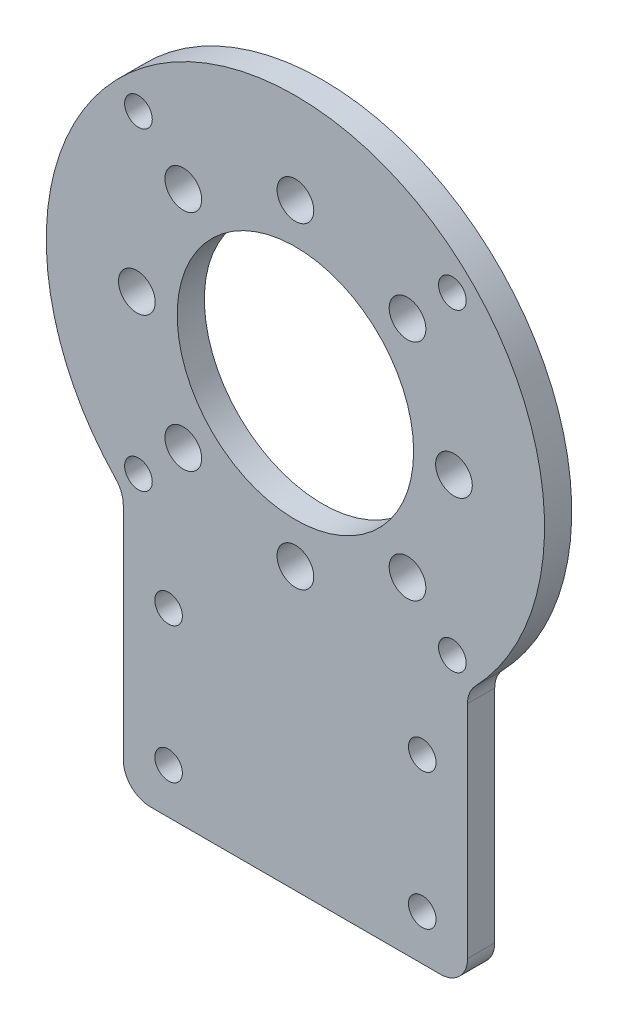
ISO-10303-21;
HEADER;
FILE_DESCRIPTION(('STEP AP214'),'2;1');
FILE_NAME('part.step','',(''),(''),'','','');
FILE_SCHEMA(('AUTOMOTIVE_DESIGN { 1 0 10303 214 1 1 1 1 }'));
ENDSEC;
DATA;
#1=APPLICATION_CONTEXT('core data for automotive mechanical design processes');
#2=APPLICATION_PROTOCOL_DEFINITION('international standard','automotive_design',2000,#1);
#3=PRODUCT_CONTEXT('',#1,'mechanical');
#4=PRODUCT('Part','Part','',(#3));
#5=PRODUCT_RELATED_PRODUCT_CATEGORY('part','',(#4));
#6=PRODUCT_DEFINITION_FORMATION('','',#4);
#7=PRODUCT_DEFINITION_CONTEXT('part definition',#1,'design');
#8=PRODUCT_DEFINITION('design','',#6,#7);
#9=PRODUCT_DEFINITION_SHAPE('','',#8);
#10=(LENGTH_UNIT() NAMED_UNIT(*) SI_UNIT(.MILLI.,.METRE.));
#11=(NAMED_UNIT(*) PLANE_ANGLE_UNIT() SI_UNIT($,.RADIAN.));
#12=(NAMED_UNIT(*) SI_UNIT($,.STERADIAN.) SOLID_ANGLE_UNIT());
#13=UNCERTAINTY_MEASURE_WITH_UNIT(LENGTH_MEASURE(1.E-05),#10,'distance_accuracy_value','');
#14=(GEOMETRIC_REPRESENTATION_CONTEXT(3) GLOBAL_UNCERTAINTY_ASSIGNED_CONTEXT((#13)) GLOBAL_UNIT_ASSIGNED_CONTEXT((#10,
#11,#12)) REPRESENTATION_CONTEXT('',''));
#15=CARTESIAN_POINT('',(0.,0.,0.));
#16=DIRECTION('',(0.,0.,1.));
#17=DIRECTION('',(1.,0.,0.));
#18=AXIS2_PLACEMENT_3D('',#15,#16,#17);
#19=CARTESIAN_POINT('',(0.,0.,1.5));
#20=DIRECTION('',(0.,0.,1.));
#21=DIRECTION('',(1.,0.,0.));
#22=AXIS2_PLACEMENT_3D('',#19,#20,#21);
#23=PLANE('',#22);
#24=CARTESIAN_POINT('',(14.,-28.5,1.5));
#25=DIRECTION('',(0.,0.,1.));
#26=DIRECTION('',(1.,0.,0.));
#27=AXIS2_PLACEMENT_3D('',#24,#25,#26);
#28=CIRCLE('',#27,1.525);
#29=CARTESIAN_POINT('',(15.525,-28.5,1.5));
#30=VERTEX_POINT('',#29);
#31=EDGE_CURVE('E175',#30,#30,#28,.T.);
#32=ORIENTED_EDGE('',*,*,#31,.F.);
#33=EDGE_LOOP('',(#32));
#34=FACE_BOUND('',#33,.T.);
#35=CARTESIAN_POINT('',(-14.,-43.5,1.5));
#36=DIRECTION('',(0.,0.,1.));
#37=DIRECTION('',(1.,0.,0.));
#38=AXIS2_PLACEMENT_3D('',#35,#36,#37);
#39=CIRCLE('',#38,1.525);
#40=CARTESIAN_POINT('',(-12.475,-43.5,1.5));
#41=VERTEX_POINT('',#40);
#42=EDGE_CURVE('E164',#41,#41,#39,.T.);
#43=ORIENTED_EDGE('',*,*,#42,.F.);
#44=EDGE_LOOP('',(#43));
#45=FACE_BOUND('',#44,.T.);
#46=CARTESIAN_POINT('',(-14.,-28.5,1.5));
#47=DIRECTION('',(0.,0.,1.));
#48=DIRECTION('',(1.,0.,0.));
#49=AXIS2_PLACEMENT_3D('',#46,#47,#48);
#50=CIRCLE('',#49,1.525);
#51=CARTESIAN_POINT('',(-12.475,-28.5,1.5));
#52=VERTEX_POINT('',#51);
#53=EDGE_CURVE('E161',#52,#52,#50,.T.);
#54=ORIENTED_EDGE('',*,*,#53,.F.);
#55=EDGE_LOOP('',(#54));
#56=FACE_BOUND('',#55,.T.);
#57=CARTESIAN_POINT('',(14.,-43.5,1.5));
#58=DIRECTION('',(0.,0.,1.));
#59=DIRECTION('',(1.,0.,0.));
#60=AXIS2_PLACEMENT_3D('',#57,#58,#59);
#61=CIRCLE('',#60,1.525);
#62=CARTESIAN_POINT('',(15.525,-43.5,1.5));
#63=VERTEX_POINT('',#62);
#64=EDGE_CURVE('E158',#63,#63,#61,.T.);
#65=ORIENTED_EDGE('',*,*,#64,.F.);
#66=EDGE_LOOP('',(#65));
#67=FACE_BOUND('',#66,.T.);
#68=CARTESIAN_POINT('',(17.3241161390705,17.3241161390703,1.5));
#69=DIRECTION('',(0.,0.,1.));
#70=DIRECTION('',(1.,0.,0.));
#71=AXIS2_PLACEMENT_3D('',#68,#69,#70);
#72=CIRCLE('',#71,1.52500000000001);
#73=CARTESIAN_POINT('',(18.8491161390705,17.3241161390703,1.5));
#74=VERTEX_POINT('',#73);
#75=EDGE_CURVE('E190',#74,#74,#72,.F.);
#76=ORIENTED_EDGE('',*,*,#75,.T.);
#77=EDGE_LOOP('',(#76));
#78=FACE_BOUND('',#77,.T.);
#79=CARTESIAN_POINT('',(17.3241161390703,-17.3241161390705,1.5));
#80=DIRECTION('',(0.,0.,1.));
#81=DIRECTION('',(1.,0.,0.));
#82=AXIS2_PLACEMENT_3D('',#79,#80,#81);
#83=CIRCLE('',#82,1.525);
#84=CARTESIAN_POINT('',(18.8491161390703,-17.3241161390705,1.5));
#85=VERTEX_POINT('',#84);
#86=EDGE_CURVE('E183',#85,#85,#83,.F.);
#87=ORIENTED_EDGE('',*,*,#86,.T.);
#88=EDGE_LOOP('',(#87));
#89=FACE_BOUND('',#88,.T.);
#90=CARTESIAN_POINT('',(-17.3241161390705,-17.3241161390703,1.5));
#91=DIRECTION('',(0.,0.,1.));
#92=DIRECTION('',(1.,0.,0.));
#93=AXIS2_PLACEMENT_3D('',#90,#91,#92);
#94=CIRCLE('',#93,1.52500000000001);
#95=CARTESIAN_POINT('',(-15.7991161390705,-17.3241161390703,1.5));
#96=VERTEX_POINT('',#95);
#97=EDGE_CURVE('E182',#96,#96,#94,.F.);
#98=ORIENTED_EDGE('',*,*,#97,.T.);
#99=EDGE_LOOP('',(#98));
#100=FACE_BOUND('',#99,.T.);
#101=CARTESIAN_POINT('',(-17.3241161390703,17.3241161390705,1.5));
#102=DIRECTION('',(0.,0.,1.));
#103=DIRECTION('',(1.,0.,0.));
#104=AXIS2_PLACEMENT_3D('',#101,#102,#103);
#105=CIRCLE('',#104,1.52500000000001);
#106=CARTESIAN_POINT('',(-15.7991161390703,17.3241161390705,1.5));
#107=VERTEX_POINT('',#106);
#108=EDGE_CURVE('E199',#107,#107,#105,.F.);
#109=ORIENTED_EDGE('',*,*,#108,.T.);
#110=EDGE_LOOP('',(#109));
#111=FACE_BOUND('',#110,.T.);
#112=CARTESIAN_POINT('',(0.,17.5,1.5));
#113=DIRECTION('',(0.,0.,1.));
#114=DIRECTION('',(1.,0.,0.));
#115=AXIS2_PLACEMENT_3D('',#112,#113,#114);
#116=CIRCLE('',#115,2.025);
#117=CARTESIAN_POINT('',(2.025,17.5,1.5));
#118=VERTEX_POINT('',#117);
#119=EDGE_CURVE('E240',#118,#118,#116,.T.);
#120=ORIENTED_EDGE('',*,*,#119,.F.);
#121=EDGE_LOOP('',(#120));
#122=FACE_BOUND('',#121,.T.);
#123=CARTESIAN_POINT('',(12.3743686707646,12.3743686707646,1.5));
#124=DIRECTION('',(0.,0.,1.));
#125=DIRECTION('',(1.,0.,0.));
#126=AXIS2_PLACEMENT_3D('',#123,#124,#125);
#127=CIRCLE('',#126,2.025);
#128=CARTESIAN_POINT('',(14.3993686707646,12.3743686707646,1.5));
#129=VERTEX_POINT('',#128);
#130=EDGE_CURVE('E236',#129,#129,#127,.T.);
#131=ORIENTED_EDGE('',*,*,#130,.F.);
#132=EDGE_LOOP('',(#131));
#133=FACE_BOUND('',#132,.T.);
#134=CARTESIAN_POINT('',(17.5,0.,1.5));
#135=DIRECTION('',(0.,0.,1.));
#136=DIRECTION('',(1.,0.,0.));
#137=AXIS2_PLACEMENT_3D('',#134,#135,#136);
#138=CIRCLE('',#137,2.025);
#139=CARTESIAN_POINT('',(19.525,0.,1.5));
#140=VERTEX_POINT('',#139);
#141=EDGE_CURVE('E232',#140,#140,#138,.T.);
#142=ORIENTED_EDGE('',*,*,#141,.F.);
#143=EDGE_LOOP('',(#142));
#144=FACE_BOUND('',#143,.T.);
#145=CARTESIAN_POINT('',(12.3743686707646,-12.3743686707646,1.5));
#146=DIRECTION('',(0.,0.,1.));
#147=DIRECTION('',(1.,0.,0.));
#148=AXIS2_PLACEMENT_3D('',#145,#146,#147);
#149=CIRCLE('',#148,2.025);
#150=CARTESIAN_POINT('',(14.3993686707646,-12.3743686707646,1.5));
#151=VERTEX_POINT('',#150);
#152=EDGE_CURVE('E228',#151,#151,#149,.T.);
#153=ORIENTED_EDGE('',*,*,#152,.F.);
#154=EDGE_LOOP('',(#153));
#155=FACE_BOUND('',#154,.T.);
#156=CARTESIAN_POINT('',(0.,-17.5,1.5));
#157=DIRECTION('',(0.,0.,1.));
#158=DIRECTION('',(1.,0.,0.));
#159=AXIS2_PLACEMENT_3D('',#156,#157,#158);
#160=CIRCLE('',#159,2.025);
#161=CARTESIAN_POINT('',(2.025,-17.5,1.5));
#162=VERTEX_POINT('',#161);
#163=EDGE_CURVE('E224',#162,#162,#160,.T.);
#164=ORIENTED_EDGE('',*,*,#163,.F.);
#165=EDGE_LOOP('',(#164));
#166=FACE_BOUND('',#165,.T.);
#167=CARTESIAN_POINT('',(-12.3743686707646,-12.3743686707646,1.5));
#168=DIRECTION('',(0.,0.,1.));
#169=DIRECTION('',(1.,0.,0.));
#170=AXIS2_PLACEMENT_3D('',#167,#168,#169);
#171=CIRCLE('',#170,2.025);
#172=CARTESIAN_POINT('',(-10.3493686707646,-12.3743686707646,1.5));
#173=VERTEX_POINT('',#172);
#174=EDGE_CURVE('E220',#173,#173,#171,.T.);
#175=ORIENTED_EDGE('',*,*,#174,.F.);
#176=EDGE_LOOP('',(#175));
#177=FACE_BOUND('',#176,.T.);
#178=CARTESIAN_POINT('',(-17.5,0.,1.5));
#179=DIRECTION('',(0.,0.,1.));
#180=DIRECTION('',(1.,0.,0.));
#181=AXIS2_PLACEMENT_3D('',#178,#179,#180);
#182=CIRCLE('',#181,2.025);
#183=CARTESIAN_POINT('',(-15.475,0.,1.5));
#184=VERTEX_POINT('',#183);
#185=EDGE_CURVE('E216',#184,#184,#182,.T.);
#186=ORIENTED_EDGE('',*,*,#185,.F.);
#187=EDGE_LOOP('',(#186));
#188=FACE_BOUND('',#187,.T.);
#189=CARTESIAN_POINT('',(-12.3743686707646,12.3743686707646,1.5));
#190=DIRECTION('',(0.,0.,1.));
#191=DIRECTION('',(1.,0.,0.));
#192=AXIS2_PLACEMENT_3D('',#189,#190,#191);
#193=CIRCLE('',#192,2.025);
#194=CARTESIAN_POINT('',(-10.3493686707646,12.3743686707646,1.5));
#195=VERTEX_POINT('',#194);
#196=EDGE_CURVE('E212',#195,#195,#193,.T.);
#197=ORIENTED_EDGE('',*,*,#196,.F.);
#198=EDGE_LOOP('',(#197));
#199=FACE_BOUND('',#198,.T.);
#200=DIRECTION('',(0.,-1.,0.));
#201=VECTOR('',#200,1.);
#202=CARTESIAN_POINT('',(-19.,-19.8808953520711,1.5));
#203=LINE('',#202,#201);
#204=CARTESIAN_POINT('',(-19.,-21.1246301742776,1.5));
#205=VERTEX_POINT('',#204);
#206=CARTESIAN_POINT('',(-19.,-45.4999999999992,1.5));
#207=VERTEX_POINT('',#206);
#208=EDGE_CURVE('E202',#205,#207,#203,.T.);
#209=ORIENTED_EDGE('',*,*,#208,.T.);
#210=CARTESIAN_POINT('',(-16.,-45.4999999999992,1.5));
#211=DIRECTION('',(0.,0.,1.));
#212=DIRECTION('',(1.,0.,0.));
#213=AXIS2_PLACEMENT_3D('',#210,#211,#212);
#214=CIRCLE('',#213,3.);
#215=CARTESIAN_POINT('',(-16.,-48.4999999999992,1.5));
#216=VERTEX_POINT('',#215);
#217=EDGE_CURVE('E128',#207,#216,#214,.T.);
#218=ORIENTED_EDGE('',*,*,#217,.T.);
#219=DIRECTION('',(1.,0.,0.));
#220=VECTOR('',#219,1.);
#221=CARTESIAN_POINT('',(-19.,-48.4999999999992,1.5));
#222=LINE('',#221,#220);
#223=CARTESIAN_POINT('',(16.,-48.4999999999992,1.5));
#224=VERTEX_POINT('',#223);
#225=EDGE_CURVE('E207',#216,#224,#222,.T.);
#226=ORIENTED_EDGE('',*,*,#225,.T.);
#227=CARTESIAN_POINT('',(16.,-45.4999999999992,1.5));
#228=DIRECTION('',(0.,0.,1.));
#229=DIRECTION('',(1.,0.,0.));
#230=AXIS2_PLACEMENT_3D('',#227,#228,#229);
#231=CIRCLE('',#230,3.);
#232=CARTESIAN_POINT('',(19.,-45.4999999999992,1.5));
#233=VERTEX_POINT('',#232);
#234=EDGE_CURVE('E129',#224,#233,#231,.T.);
#235=ORIENTED_EDGE('',*,*,#234,.T.);
#236=DIRECTION('',(0.,1.,0.));
#237=VECTOR('',#236,1.);
#238=CARTESIAN_POINT('',(19.,-48.4999999999992,1.5));
#239=LINE('',#238,#237);
#240=CARTESIAN_POINT('',(19.,-21.1246301742776,1.5));
#241=VERTEX_POINT('',#240);
#242=EDGE_CURVE('E204',#233,#241,#239,.T.);
#243=ORIENTED_EDGE('',*,*,#242,.T.);
#244=CARTESIAN_POINT('',(22.,-21.1246301742776,1.5));
#245=DIRECTION('',(0.,0.,1.));
#246=DIRECTION('',(1.,0.,0.));
#247=AXIS2_PLACEMENT_3D('',#244,#245,#246);
#248=CIRCLE('',#247,3.);
#249=CARTESIAN_POINT('',(19.8360655737705,-19.0467976981192,1.5));
#250=VERTEX_POINT('',#249);
#251=EDGE_CURVE('E151',#241,#250,#248,.F.);
#252=ORIENTED_EDGE('',*,*,#251,.T.);
#253=CARTESIAN_POINT('',(0.,0.,1.5));
#254=DIRECTION('',(0.,0.,1.));
#255=DIRECTION('',(1.,0.,0.));
#256=AXIS2_PLACEMENT_3D('',#253,#254,#255);
#257=CIRCLE('',#256,27.5);
#258=CARTESIAN_POINT('',(-19.8360655737705,-19.0467976981192,1.5));
#259=VERTEX_POINT('',#258);
#260=EDGE_CURVE('E132',#250,#259,#257,.T.);
#261=ORIENTED_EDGE('',*,*,#260,.T.);
#262=CARTESIAN_POINT('',(-22.,-21.1246301742776,1.5));
#263=DIRECTION('',(0.,0.,1.));
#264=DIRECTION('',(1.,0.,0.));
#265=AXIS2_PLACEMENT_3D('',#262,#263,#264);
#266=CIRCLE('',#265,3.);
#267=EDGE_CURVE('E43',#259,#205,#266,.F.);
#268=ORIENTED_EDGE('',*,*,#267,.T.);
#269=EDGE_LOOP('',(#209,#218,#226,#235,#243,#252,#261,#268));
#270=FACE_BOUND('',#269,.T.);
#271=CARTESIAN_POINT('',(0.,0.,1.5));
#272=DIRECTION('',(0.,0.,1.));
#273=DIRECTION('',(1.,0.,0.));
#274=AXIS2_PLACEMENT_3D('',#271,#272,#273);
#275=CIRCLE('',#274,13.05);
#276=CARTESIAN_POINT('',(13.05,0.,1.5));
#277=VERTEX_POINT('',#276);
#278=EDGE_CURVE('E244',#277,#277,#275,.T.);
#279=ORIENTED_EDGE('',*,*,#278,.F.);
#280=EDGE_LOOP('',(#279));
#281=FACE_BOUND('',#280,.T.);
#282=ADVANCED_FACE('F34',(#34,#45,#56,#67,#78,#89,#100,#111,#122,#133,#144,#155,#166,#177,#188,
#199,#270,#281),#23,.T.);
#283=CARTESIAN_POINT('',(0.,0.,-1.5));
#284=DIRECTION('',(0.,0.,1.));
#285=DIRECTION('',(1.,0.,0.));
#286=AXIS2_PLACEMENT_3D('',#283,#284,#285);
#287=PLANE('',#286);
#288=CARTESIAN_POINT('',(14.,-28.5,-1.5));
#289=DIRECTION('',(0.,0.,1.));
#290=DIRECTION('',(1.,0.,0.));
#291=AXIS2_PLACEMENT_3D('',#288,#289,#290);
#292=CIRCLE('',#291,1.525);
#293=CARTESIAN_POINT('',(15.525,-28.5,-1.5));
#294=VERTEX_POINT('',#293);
#295=EDGE_CURVE('E38',#294,#294,#292,.T.);
#296=ORIENTED_EDGE('',*,*,#295,.T.);
#297=EDGE_LOOP('',(#296));
#298=FACE_BOUND('',#297,.T.);
#299=CARTESIAN_POINT('',(-14.,-43.5,-1.5));
#300=DIRECTION('',(0.,0.,1.));
#301=DIRECTION('',(1.,0.,0.));
#302=AXIS2_PLACEMENT_3D('',#299,#300,#301);
#303=CIRCLE('',#302,1.525);
#304=CARTESIAN_POINT('',(-12.475,-43.5,-1.5));
#305=VERTEX_POINT('',#304);
#306=EDGE_CURVE('E162',#305,#305,#303,.T.);
#307=ORIENTED_EDGE('',*,*,#306,.T.);
#308=EDGE_LOOP('',(#307));
#309=FACE_BOUND('',#308,.T.);
#310=CARTESIAN_POINT('',(-14.,-28.5,-1.5));
#311=DIRECTION('',(0.,0.,1.));
#312=DIRECTION('',(1.,0.,0.));
#313=AXIS2_PLACEMENT_3D('',#310,#311,#312);
#314=CIRCLE('',#313,1.525);
#315=CARTESIAN_POINT('',(-12.475,-28.5,-1.5));
#316=VERTEX_POINT('',#315);
#317=EDGE_CURVE('E159',#316,#316,#314,.T.);
#318=ORIENTED_EDGE('',*,*,#317,.T.);
#319=EDGE_LOOP('',(#318));
#320=FACE_BOUND('',#319,.T.);
#321=CARTESIAN_POINT('',(14.,-43.5,-1.5));
#322=DIRECTION('',(0.,0.,1.));
#323=DIRECTION('',(1.,0.,0.));
#324=AXIS2_PLACEMENT_3D('',#321,#322,#323);
#325=CIRCLE('',#324,1.525);
#326=CARTESIAN_POINT('',(15.525,-43.5,-1.5));
#327=VERTEX_POINT('',#326);
#328=EDGE_CURVE('E155',#327,#327,#325,.T.);
#329=ORIENTED_EDGE('',*,*,#328,.T.);
#330=EDGE_LOOP('',(#329));
#331=FACE_BOUND('',#330,.T.);
#332=CARTESIAN_POINT('',(17.3241161390705,17.3241161390703,-1.5));
#333=DIRECTION('',(0.,0.,-1.));
#334=DIRECTION('',(-1.,0.,0.));
#335=AXIS2_PLACEMENT_3D('',#332,#333,#334);
#336=CIRCLE('',#335,1.52500000000001);
#337=CARTESIAN_POINT('',(15.7991161390705,17.3241161390703,-1.5));
#338=VERTEX_POINT('',#337);
#339=EDGE_CURVE('E178',#338,#338,#336,.T.);
#340=ORIENTED_EDGE('',*,*,#339,.F.);
#341=EDGE_LOOP('',(#340));
#342=FACE_BOUND('',#341,.T.);
#343=CARTESIAN_POINT('',(17.3241161390703,-17.3241161390705,-1.5));
#344=DIRECTION('',(0.,0.,-1.));
#345=DIRECTION('',(-1.,0.,0.));
#346=AXIS2_PLACEMENT_3D('',#343,#344,#345);
#347=CIRCLE('',#346,1.525);
#348=CARTESIAN_POINT('',(15.7991161390703,-17.3241161390705,-1.5));
#349=VERTEX_POINT('',#348);
#350=EDGE_CURVE('E187',#349,#349,#347,.T.);
#351=ORIENTED_EDGE('',*,*,#350,.F.);
#352=EDGE_LOOP('',(#351));
#353=FACE_BOUND('',#352,.T.);
#354=CARTESIAN_POINT('',(-17.3241161390705,-17.3241161390703,-1.5));
#355=DIRECTION('',(0.,0.,-1.));
#356=DIRECTION('',(-1.,0.,0.));
#357=AXIS2_PLACEMENT_3D('',#354,#355,#356);
#358=CIRCLE('',#357,1.52500000000001);
#359=CARTESIAN_POINT('',(-18.8491161390705,-17.3241161390703,-1.5));
#360=VERTEX_POINT('',#359);
#361=EDGE_CURVE('E179',#360,#360,#358,.T.);
#362=ORIENTED_EDGE('',*,*,#361,.F.);
#363=EDGE_LOOP('',(#362));
#364=FACE_BOUND('',#363,.T.);
#365=CARTESIAN_POINT('',(-17.3241161390703,17.3241161390705,-1.5));
#366=DIRECTION('',(0.,0.,-1.));
#367=DIRECTION('',(-1.,0.,0.));
#368=AXIS2_PLACEMENT_3D('',#365,#366,#367);
#369=CIRCLE('',#368,1.52500000000001);
#370=CARTESIAN_POINT('',(-18.8491161390703,17.3241161390705,-1.5));
#371=VERTEX_POINT('',#370);
#372=EDGE_CURVE('E186',#371,#371,#369,.T.);
#373=ORIENTED_EDGE('',*,*,#372,.F.);
#374=EDGE_LOOP('',(#373));
#375=FACE_BOUND('',#374,.T.);
#376=CARTESIAN_POINT('',(0.,17.5,-1.5));
#377=DIRECTION('',(0.,0.,1.));
#378=DIRECTION('',(1.,0.,0.));
#379=AXIS2_PLACEMENT_3D('',#376,#377,#378);
#380=CIRCLE('',#379,2.025);
#381=CARTESIAN_POINT('',(2.025,17.5,-1.5));
#382=VERTEX_POINT('',#381);
#383=EDGE_CURVE('E239',#382,#382,#380,.T.);
#384=ORIENTED_EDGE('',*,*,#383,.T.);
#385=EDGE_LOOP('',(#384));
#386=FACE_BOUND('',#385,.T.);
#387=CARTESIAN_POINT('',(12.3743686707646,12.3743686707646,-1.5));
#388=DIRECTION('',(0.,0.,1.));
#389=DIRECTION('',(1.,0.,0.));
#390=AXIS2_PLACEMENT_3D('',#387,#388,#389);
#391=CIRCLE('',#390,2.025);
#392=CARTESIAN_POINT('',(14.3993686707646,12.3743686707646,-1.5));
#393=VERTEX_POINT('',#392);
#394=EDGE_CURVE('E235',#393,#393,#391,.T.);
#395=ORIENTED_EDGE('',*,*,#394,.T.);
#396=EDGE_LOOP('',(#395));
#397=FACE_BOUND('',#396,.T.);
#398=CARTESIAN_POINT('',(17.5,0.,-1.5));
#399=DIRECTION('',(0.,0.,1.));
#400=DIRECTION('',(1.,0.,0.));
#401=AXIS2_PLACEMENT_3D('',#398,#399,#400);
#402=CIRCLE('',#401,2.025);
#403=CARTESIAN_POINT('',(19.525,0.,-1.5));
#404=VERTEX_POINT('',#403);
#405=EDGE_CURVE('E231',#404,#404,#402,.T.);
#406=ORIENTED_EDGE('',*,*,#405,.T.);
#407=EDGE_LOOP('',(#406));
#408=FACE_BOUND('',#407,.T.);
#409=CARTESIAN_POINT('',(12.3743686707646,-12.3743686707646,-1.5));
#410=DIRECTION('',(0.,0.,1.));
#411=DIRECTION('',(1.,0.,0.));
#412=AXIS2_PLACEMENT_3D('',#409,#410,#411);
#413=CIRCLE('',#412,2.025);
#414=CARTESIAN_POINT('',(14.3993686707646,-12.3743686707646,-1.5));
#415=VERTEX_POINT('',#414);
#416=EDGE_CURVE('E227',#415,#415,#413,.T.);
#417=ORIENTED_EDGE('',*,*,#416,.T.);
#418=EDGE_LOOP('',(#417));
#419=FACE_BOUND('',#418,.T.);
#420=CARTESIAN_POINT('',(0.,-17.5,-1.5));
#421=DIRECTION('',(0.,0.,1.));
#422=DIRECTION('',(1.,0.,0.));
#423=AXIS2_PLACEMENT_3D('',#420,#421,#422);
#424=CIRCLE('',#423,2.025);
#425=CARTESIAN_POINT('',(2.025,-17.5,-1.5));
#426=VERTEX_POINT('',#425);
#427=EDGE_CURVE('E223',#426,#426,#424,.T.);
#428=ORIENTED_EDGE('',*,*,#427,.T.);
#429=EDGE_LOOP('',(#428));
#430=FACE_BOUND('',#429,.T.);
#431=CARTESIAN_POINT('',(-12.3743686707646,-12.3743686707646,-1.5));
#432=DIRECTION('',(0.,0.,1.));
#433=DIRECTION('',(1.,0.,0.));
#434=AXIS2_PLACEMENT_3D('',#431,#432,#433);
#435=CIRCLE('',#434,2.025);
#436=CARTESIAN_POINT('',(-10.3493686707646,-12.3743686707646,-1.5));
#437=VERTEX_POINT('',#436);
#438=EDGE_CURVE('E219',#437,#437,#435,.T.);
#439=ORIENTED_EDGE('',*,*,#438,.T.);
#440=EDGE_LOOP('',(#439));
#441=FACE_BOUND('',#440,.T.);
#442=CARTESIAN_POINT('',(-17.5,0.,-1.5));
#443=DIRECTION('',(0.,0.,1.));
#444=DIRECTION('',(1.,0.,0.));
#445=AXIS2_PLACEMENT_3D('',#442,#443,#444);
#446=CIRCLE('',#445,2.025);
#447=CARTESIAN_POINT('',(-15.475,0.,-1.5));
#448=VERTEX_POINT('',#447);
#449=EDGE_CURVE('E215',#448,#448,#446,.T.);
#450=ORIENTED_EDGE('',*,*,#449,.T.);
#451=EDGE_LOOP('',(#450));
#452=FACE_BOUND('',#451,.T.);
#453=CARTESIAN_POINT('',(-12.3743686707646,12.3743686707646,-1.5));
#454=DIRECTION('',(0.,0.,1.));
#455=DIRECTION('',(1.,0.,0.));
#456=AXIS2_PLACEMENT_3D('',#453,#454,#455);
#457=CIRCLE('',#456,2.025);
#458=CARTESIAN_POINT('',(-10.3493686707646,12.3743686707646,-1.5));
#459=VERTEX_POINT('',#458);
#460=EDGE_CURVE('E124',#459,#459,#457,.T.);
#461=ORIENTED_EDGE('',*,*,#460,.T.);
#462=EDGE_LOOP('',(#461));
#463=FACE_BOUND('',#462,.T.);
#464=DIRECTION('',(-1.,0.,0.));
#465=VECTOR('',#464,1.);
#466=CARTESIAN_POINT('',(-19.,-48.4999999999992,-1.5));
#467=LINE('',#466,#465);
#468=CARTESIAN_POINT('',(16.,-48.4999999999992,-1.5));
#469=VERTEX_POINT('',#468);
#470=CARTESIAN_POINT('',(-16.,-48.4999999999992,-1.5));
#471=VERTEX_POINT('',#470);
#472=EDGE_CURVE('E109',#469,#471,#467,.T.);
#473=ORIENTED_EDGE('',*,*,#472,.T.);
#474=CARTESIAN_POINT('',(-16.,-45.4999999999992,-1.5));
#475=DIRECTION('',(0.,0.,1.));
#476=DIRECTION('',(1.,0.,0.));
#477=AXIS2_PLACEMENT_3D('',#474,#475,#476);
#478=CIRCLE('',#477,3.);
#479=CARTESIAN_POINT('',(-19.,-45.4999999999992,-1.5));
#480=VERTEX_POINT('',#479);
#481=EDGE_CURVE('E102',#471,#480,#478,.F.);
#482=ORIENTED_EDGE('',*,*,#481,.T.);
#483=DIRECTION('',(0.,1.,0.));
#484=VECTOR('',#483,1.);
#485=CARTESIAN_POINT('',(-19.,-19.8808953520711,-1.5));
#486=LINE('',#485,#484);
#487=CARTESIAN_POINT('',(-19.,-21.1246301742776,-1.5));
#488=VERTEX_POINT('',#487);
#489=EDGE_CURVE('E106',#480,#488,#486,.T.);
#490=ORIENTED_EDGE('',*,*,#489,.T.);
#491=CARTESIAN_POINT('',(-22.,-21.1246301742776,-1.5));
#492=DIRECTION('',(0.,0.,1.));
#493=DIRECTION('',(1.,0.,0.));
#494=AXIS2_PLACEMENT_3D('',#491,#492,#493);
#495=CIRCLE('',#494,3.);
#496=CARTESIAN_POINT('',(-19.8360655737705,-19.0467976981192,-1.5));
#497=VERTEX_POINT('',#496);
#498=EDGE_CURVE('E11',#488,#497,#495,.T.);
#499=ORIENTED_EDGE('',*,*,#498,.T.);
#500=CARTESIAN_POINT('',(0.,0.,-1.5));
#501=DIRECTION('',(0.,0.,1.));
#502=DIRECTION('',(1.,0.,0.));
#503=AXIS2_PLACEMENT_3D('',#500,#501,#502);
#504=CIRCLE('',#503,27.5);
#505=CARTESIAN_POINT('',(19.8360655737705,-19.0467976981192,-1.5));
#506=VERTEX_POINT('',#505);
#507=EDGE_CURVE('E247',#506,#497,#504,.T.);
#508=ORIENTED_EDGE('',*,*,#507,.F.);
#509=CARTESIAN_POINT('',(22.,-21.1246301742776,-1.5));
#510=DIRECTION('',(0.,0.,1.));
#511=DIRECTION('',(1.,0.,0.));
#512=AXIS2_PLACEMENT_3D('',#509,#510,#511);
#513=CIRCLE('',#512,3.);
#514=CARTESIAN_POINT('',(19.,-21.1246301742776,-1.5));
#515=VERTEX_POINT('',#514);
#516=EDGE_CURVE('E58',#506,#515,#513,.T.);
#517=ORIENTED_EDGE('',*,*,#516,.T.);
#518=DIRECTION('',(0.,-1.,0.));
#519=VECTOR('',#518,1.);
#520=CARTESIAN_POINT('',(19.,-48.4999999999992,-1.5));
#521=LINE('',#520,#519);
#522=CARTESIAN_POINT('',(19.,-45.4999999999992,-1.5));
#523=VERTEX_POINT('',#522);
#524=EDGE_CURVE('E125',#515,#523,#521,.T.);
#525=ORIENTED_EDGE('',*,*,#524,.T.);
#526=CARTESIAN_POINT('',(16.,-45.4999999999992,-1.5));
#527=DIRECTION('',(0.,0.,1.));
#528=DIRECTION('',(1.,0.,0.));
#529=AXIS2_PLACEMENT_3D('',#526,#527,#528);
#530=CIRCLE('',#529,3.);
#531=EDGE_CURVE('E114',#523,#469,#530,.F.);
#532=ORIENTED_EDGE('',*,*,#531,.T.);
#533=EDGE_LOOP('',(#473,#482,#490,#499,#508,#517,#525,#532));
#534=FACE_BOUND('',#533,.T.);
#535=CARTESIAN_POINT('',(0.,0.,-1.5));
#536=DIRECTION('',(0.,0.,1.));
#537=DIRECTION('',(1.,0.,0.));
#538=AXIS2_PLACEMENT_3D('',#535,#536,#537);
#539=CIRCLE('',#538,13.05);
#540=CARTESIAN_POINT('',(13.05,0.,-1.5));
#541=VERTEX_POINT('',#540);
#542=EDGE_CURVE('E243',#541,#541,#539,.T.);
#543=ORIENTED_EDGE('',*,*,#542,.T.);
#544=EDGE_LOOP('',(#543));
#545=FACE_BOUND('',#544,.T.);
#546=ADVANCED_FACE('F104',(#298,#309,#320,#331,#342,#353,#364,#375,#386,#397,#408,#419,#430,
#441,#452,#463,#534,#545),#287,.F.);
#547=CARTESIAN_POINT('',(0.,0.,1.5));
#548=DIRECTION('',(0.,0.,-1.));
#549=DIRECTION('',(-1.,0.,0.));
#550=AXIS2_PLACEMENT_3D('',#547,#548,#549);
#551=CYLINDRICAL_SURFACE('',#550,27.5);
#552=ORIENTED_EDGE('',*,*,#260,.F.);
#553=DIRECTION('',(0.,0.,-1.));
#554=VECTOR('',#553,1.);
#555=CARTESIAN_POINT('',(19.8360655737705,-19.0467976981192,1.5));
#556=LINE('',#555,#554);
#557=EDGE_CURVE('E149',#250,#506,#556,.T.);
#558=ORIENTED_EDGE('',*,*,#557,.T.);
#559=ORIENTED_EDGE('',*,*,#507,.T.);
#560=DIRECTION('',(0.,0.,-1.));
#561=VECTOR('',#560,1.);
#562=CARTESIAN_POINT('',(-19.8360655737705,-19.0467976981192,1.5));
#563=LINE('',#562,#561);
#564=EDGE_CURVE('E146',#497,#259,#563,.F.);
#565=ORIENTED_EDGE('',*,*,#564,.T.);
#566=EDGE_LOOP('',(#552,#558,#559,#565));
#567=FACE_BOUND('',#566,.T.);
#568=ADVANCED_FACE('F294',(#567),#551,.T.);
#569=CARTESIAN_POINT('',(0.,0.,1.5));
#570=DIRECTION('',(0.,0.,-1.));
#571=DIRECTION('',(-1.,0.,0.));
#572=AXIS2_PLACEMENT_3D('',#569,#570,#571);
#573=CYLINDRICAL_SURFACE('',#572,13.05);
#574=ORIENTED_EDGE('',*,*,#278,.T.);
#575=EDGE_LOOP('',(#574));
#576=FACE_BOUND('',#575,.T.);
#577=ORIENTED_EDGE('',*,*,#542,.F.);
#578=EDGE_LOOP('',(#577));
#579=FACE_BOUND('',#578,.T.);
#580=ADVANCED_FACE('F300',(#576,#579),#573,.F.);
#581=CARTESIAN_POINT('',(-12.3743686707646,12.3743686707646,-15.5));
#582=DIRECTION('',(0.,0.,1.));
#583=DIRECTION('',(1.,0.,0.));
#584=AXIS2_PLACEMENT_3D('',#581,#582,#583);
#585=CYLINDRICAL_SURFACE('',#584,2.025);
#586=ORIENTED_EDGE('',*,*,#196,.T.);
#587=EDGE_LOOP('',(#586));
#588=FACE_BOUND('',#587,.T.);
#589=ORIENTED_EDGE('',*,*,#460,.F.);
#590=EDGE_LOOP('',(#589));
#591=FACE_BOUND('',#590,.T.);
#592=ADVANCED_FACE('F398',(#588,#591),#585,.F.);
#593=CARTESIAN_POINT('',(-17.5,0.,-15.5));
#594=DIRECTION('',(0.,0.,1.));
#595=DIRECTION('',(1.,0.,0.));
#596=AXIS2_PLACEMENT_3D('',#593,#594,#595);
#597=CYLINDRICAL_SURFACE('',#596,2.025);
#598=ORIENTED_EDGE('',*,*,#185,.T.);
#599=EDGE_LOOP('',(#598));
#600=FACE_BOUND('',#599,.T.);
#601=ORIENTED_EDGE('',*,*,#449,.F.);
#602=EDGE_LOOP('',(#601));
#603=FACE_BOUND('',#602,.T.);
#604=ADVANCED_FACE('F401',(#600,#603),#597,.F.);
#605=CARTESIAN_POINT('',(-12.3743686707646,-12.3743686707646,-15.5));
#606=DIRECTION('',(0.,0.,1.));
#607=DIRECTION('',(1.,0.,0.));
#608=AXIS2_PLACEMENT_3D('',#605,#606,#607);
#609=CYLINDRICAL_SURFACE('',#608,2.025);
#610=ORIENTED_EDGE('',*,*,#174,.T.);
#611=EDGE_LOOP('',(#610));
#612=FACE_BOUND('',#611,.T.);
#613=ORIENTED_EDGE('',*,*,#438,.F.);
#614=EDGE_LOOP('',(#613));
#615=FACE_BOUND('',#614,.T.);
#616=ADVANCED_FACE('F408',(#612,#615),#609,.F.);
#617=CARTESIAN_POINT('',(0.,-17.5,-15.5));
#618=DIRECTION('',(0.,0.,1.));
#619=DIRECTION('',(1.,0.,0.));
#620=AXIS2_PLACEMENT_3D('',#617,#618,#619);
#621=CYLINDRICAL_SURFACE('',#620,2.025);
#622=ORIENTED_EDGE('',*,*,#163,.T.);
#623=EDGE_LOOP('',(#622));
#624=FACE_BOUND('',#623,.T.);
#625=ORIENTED_EDGE('',*,*,#427,.F.);
#626=EDGE_LOOP('',(#625));
#627=FACE_BOUND('',#626,.T.);
#628=ADVANCED_FACE('F415',(#624,#627),#621,.F.);
#629=CARTESIAN_POINT('',(12.3743686707646,-12.3743686707646,-15.5));
#630=DIRECTION('',(0.,0.,1.));
#631=DIRECTION('',(1.,0.,0.));
#632=AXIS2_PLACEMENT_3D('',#629,#630,#631);
#633=CYLINDRICAL_SURFACE('',#632,2.025);
#634=ORIENTED_EDGE('',*,*,#152,.T.);
#635=EDGE_LOOP('',(#634));
#636=FACE_BOUND('',#635,.T.);
#637=ORIENTED_EDGE('',*,*,#416,.F.);
#638=EDGE_LOOP('',(#637));
#639=FACE_BOUND('',#638,.T.);
#640=ADVANCED_FACE('F419',(#636,#639),#633,.F.);
#641=CARTESIAN_POINT('',(17.5,0.,-15.5));
#642=DIRECTION('',(0.,0.,1.));
#643=DIRECTION('',(1.,0.,0.));
#644=AXIS2_PLACEMENT_3D('',#641,#642,#643);
#645=CYLINDRICAL_SURFACE('',#644,2.025);
#646=ORIENTED_EDGE('',*,*,#141,.T.);
#647=EDGE_LOOP('',(#646));
#648=FACE_BOUND('',#647,.T.);
#649=ORIENTED_EDGE('',*,*,#405,.F.);
#650=EDGE_LOOP('',(#649));
#651=FACE_BOUND('',#650,.T.);
#652=ADVANCED_FACE('F284',(#648,#651),#645,.F.);
#653=CARTESIAN_POINT('',(12.3743686707646,12.3743686707646,-15.5));
#654=DIRECTION('',(0.,0.,1.));
#655=DIRECTION('',(1.,0.,0.));
#656=AXIS2_PLACEMENT_3D('',#653,#654,#655);
#657=CYLINDRICAL_SURFACE('',#656,2.025);
#658=ORIENTED_EDGE('',*,*,#130,.T.);
#659=EDGE_LOOP('',(#658));
#660=FACE_BOUND('',#659,.T.);
#661=ORIENTED_EDGE('',*,*,#394,.F.);
#662=EDGE_LOOP('',(#661));
#663=FACE_BOUND('',#662,.T.);
#664=ADVANCED_FACE('F275',(#660,#663),#657,.F.);
#665=CARTESIAN_POINT('',(0.,17.5,-15.5));
#666=DIRECTION('',(0.,0.,1.));
#667=DIRECTION('',(1.,0.,0.));
#668=AXIS2_PLACEMENT_3D('',#665,#666,#667);
#669=CYLINDRICAL_SURFACE('',#668,2.025);
#670=ORIENTED_EDGE('',*,*,#119,.T.);
#671=EDGE_LOOP('',(#670));
#672=FACE_BOUND('',#671,.T.);
#673=ORIENTED_EDGE('',*,*,#383,.F.);
#674=EDGE_LOOP('',(#673));
#675=FACE_BOUND('',#674,.T.);
#676=ADVANCED_FACE('F272',(#672,#675),#669,.F.);
#677=CARTESIAN_POINT('',(19.,-48.4999999999992,-49.0715582133806));
#678=DIRECTION('',(1.,0.,0.));
#679=DIRECTION('',(0.,1.,0.));
#680=AXIS2_PLACEMENT_3D('',#677,#678,#679);
#681=PLANE('',#680);
#682=ORIENTED_EDGE('',*,*,#242,.F.);
#683=DIRECTION('',(0.,0.,1.));
#684=VECTOR('',#683,1.);
#685=CARTESIAN_POINT('',(19.,-45.4999999999992,-49.0715582133806));
#686=LINE('',#685,#684);
#687=EDGE_CURVE('E51',#233,#523,#686,.F.);
#688=ORIENTED_EDGE('',*,*,#687,.T.);
#689=ORIENTED_EDGE('',*,*,#524,.F.);
#690=DIRECTION('',(0.,0.,-1.));
#691=VECTOR('',#690,1.);
#692=CARTESIAN_POINT('',(19.,-21.1246301742776,-49.0715582133806));
#693=LINE('',#692,#691);
#694=EDGE_CURVE('E113',#515,#241,#693,.F.);
#695=ORIENTED_EDGE('',*,*,#694,.T.);
#696=EDGE_LOOP('',(#682,#688,#689,#695));
#697=FACE_BOUND('',#696,.T.);
#698=ADVANCED_FACE('F274',(#697),#681,.T.);
#699=CARTESIAN_POINT('',(-19.,-48.4999999999992,-49.0715582133806));
#700=DIRECTION('',(0.,-1.,0.));
#701=DIRECTION('',(1.,0.,0.));
#702=AXIS2_PLACEMENT_3D('',#699,#700,#701);
#703=PLANE('',#702);
#704=ORIENTED_EDGE('',*,*,#225,.F.);
#705=DIRECTION('',(0.,0.,1.));
#706=VECTOR('',#705,1.);
#707=CARTESIAN_POINT('',(-16.,-48.4999999999992,-49.0715582133806));
#708=LINE('',#707,#706);
#709=EDGE_CURVE('E140',#216,#471,#708,.F.);
#710=ORIENTED_EDGE('',*,*,#709,.T.);
#711=ORIENTED_EDGE('',*,*,#472,.F.);
#712=DIRECTION('',(0.,0.,1.));
#713=VECTOR('',#712,1.);
#714=CARTESIAN_POINT('',(16.,-48.4999999999992,-49.0715582133806));
#715=LINE('',#714,#713);
#716=EDGE_CURVE('E137',#469,#224,#715,.T.);
#717=ORIENTED_EDGE('',*,*,#716,.T.);
#718=EDGE_LOOP('',(#704,#710,#711,#717));
#719=FACE_BOUND('',#718,.T.);
#720=ADVANCED_FACE('F282',(#719),#703,.T.);
#721=CARTESIAN_POINT('',(-19.,-19.8808953520711,-49.0715582133806));
#722=DIRECTION('',(-1.,0.,0.));
#723=DIRECTION('',(0.,-1.,0.));
#724=AXIS2_PLACEMENT_3D('',#721,#722,#723);
#725=PLANE('',#724);
#726=ORIENTED_EDGE('',*,*,#489,.F.);
#727=DIRECTION('',(0.,0.,1.));
#728=VECTOR('',#727,1.);
#729=CARTESIAN_POINT('',(-19.,-45.4999999999992,-49.0715582133806));
#730=LINE('',#729,#728);
#731=EDGE_CURVE('E120',#480,#207,#730,.T.);
#732=ORIENTED_EDGE('',*,*,#731,.T.);
#733=ORIENTED_EDGE('',*,*,#208,.F.);
#734=DIRECTION('',(0.,0.,-1.));
#735=VECTOR('',#734,1.);
#736=CARTESIAN_POINT('',(-19.,-21.1246301742776,-49.0715582133806));
#737=LINE('',#736,#735);
#738=EDGE_CURVE('E123',#205,#488,#737,.T.);
#739=ORIENTED_EDGE('',*,*,#738,.T.);
#740=EDGE_LOOP('',(#726,#732,#733,#739));
#741=FACE_BOUND('',#740,.T.);
#742=ADVANCED_FACE('F118',(#741),#725,.T.);
#743=CARTESIAN_POINT('',(-17.3241161390703,17.3241161390705,5.81335136523796));
#744=DIRECTION('',(0.,0.,-1.));
#745=DIRECTION('',(-1.,0.,0.));
#746=AXIS2_PLACEMENT_3D('',#743,#744,#745);
#747=CYLINDRICAL_SURFACE('',#746,1.52500000000001);
#748=ORIENTED_EDGE('',*,*,#372,.T.);
#749=EDGE_LOOP('',(#748));
#750=FACE_BOUND('',#749,.T.);
#751=ORIENTED_EDGE('',*,*,#108,.F.);
#752=EDGE_LOOP('',(#751));
#753=FACE_BOUND('',#752,.T.);
#754=ADVANCED_FACE('F334',(#750,#753),#747,.F.);
#755=CARTESIAN_POINT('',(-17.3241161390705,-17.3241161390703,5.81335136523796));
#756=DIRECTION('',(0.,0.,-1.));
#757=DIRECTION('',(-1.,0.,0.));
#758=AXIS2_PLACEMENT_3D('',#755,#756,#757);
#759=CYLINDRICAL_SURFACE('',#758,1.52500000000001);
#760=ORIENTED_EDGE('',*,*,#361,.T.);
#761=EDGE_LOOP('',(#760));
#762=FACE_BOUND('',#761,.T.);
#763=ORIENTED_EDGE('',*,*,#97,.F.);
#764=EDGE_LOOP('',(#763));
#765=FACE_BOUND('',#764,.T.);
#766=ADVANCED_FACE('F338',(#762,#765),#759,.F.);
#767=CARTESIAN_POINT('',(17.3241161390703,-17.3241161390705,5.81335136523796));
#768=DIRECTION('',(0.,0.,-1.));
#769=DIRECTION('',(-1.,0.,0.));
#770=AXIS2_PLACEMENT_3D('',#767,#768,#769);
#771=CYLINDRICAL_SURFACE('',#770,1.525);
#772=ORIENTED_EDGE('',*,*,#350,.T.);
#773=EDGE_LOOP('',(#772));
#774=FACE_BOUND('',#773,.T.);
#775=ORIENTED_EDGE('',*,*,#86,.F.);
#776=EDGE_LOOP('',(#775));
#777=FACE_BOUND('',#776,.T.);
#778=ADVANCED_FACE('F342',(#774,#777),#771,.F.);
#779=CARTESIAN_POINT('',(17.3241161390705,17.3241161390703,5.81335136523796));
#780=DIRECTION('',(0.,0.,-1.));
#781=DIRECTION('',(-1.,0.,0.));
#782=AXIS2_PLACEMENT_3D('',#779,#780,#781);
#783=CYLINDRICAL_SURFACE('',#782,1.52500000000001);
#784=ORIENTED_EDGE('',*,*,#339,.T.);
#785=EDGE_LOOP('',(#784));
#786=FACE_BOUND('',#785,.T.);
#787=ORIENTED_EDGE('',*,*,#75,.F.);
#788=EDGE_LOOP('',(#787));
#789=FACE_BOUND('',#788,.T.);
#790=ADVANCED_FACE('F309',(#786,#789),#783,.F.);
#791=CARTESIAN_POINT('',(-16.,-45.4999999999992,-49.0715582133806));
#792=DIRECTION('',(0.,0.,1.));
#793=DIRECTION('',(1.,0.,0.));
#794=AXIS2_PLACEMENT_3D('',#791,#792,#793);
#795=CYLINDRICAL_SURFACE('',#794,3.);
#796=ORIENTED_EDGE('',*,*,#481,.F.);
#797=ORIENTED_EDGE('',*,*,#709,.F.);
#798=ORIENTED_EDGE('',*,*,#217,.F.);
#799=ORIENTED_EDGE('',*,*,#731,.F.);
#800=EDGE_LOOP('',(#796,#797,#798,#799));
#801=FACE_BOUND('',#800,.T.);
#802=ADVANCED_FACE('F127',(#801),#795,.T.);
#803=CARTESIAN_POINT('',(16.,-45.4999999999992,-49.0715582133806));
#804=DIRECTION('',(0.,0.,1.));
#805=DIRECTION('',(1.,0.,0.));
#806=AXIS2_PLACEMENT_3D('',#803,#804,#805);
#807=CYLINDRICAL_SURFACE('',#806,3.);
#808=ORIENTED_EDGE('',*,*,#531,.F.);
#809=ORIENTED_EDGE('',*,*,#687,.F.);
#810=ORIENTED_EDGE('',*,*,#234,.F.);
#811=ORIENTED_EDGE('',*,*,#716,.F.);
#812=EDGE_LOOP('',(#808,#809,#810,#811));
#813=FACE_BOUND('',#812,.T.);
#814=ADVANCED_FACE('F308',(#813),#807,.T.);
#815=CARTESIAN_POINT('',(22.,-21.1246301742776,1.5));
#816=DIRECTION('',(0.,0.,-1.));
#817=DIRECTION('',(-1.,0.,0.));
#818=AXIS2_PLACEMENT_3D('',#815,#816,#817);
#819=CYLINDRICAL_SURFACE('',#818,3.);
#820=ORIENTED_EDGE('',*,*,#516,.F.);
#821=ORIENTED_EDGE('',*,*,#557,.F.);
#822=ORIENTED_EDGE('',*,*,#251,.F.);
#823=ORIENTED_EDGE('',*,*,#694,.F.);
#824=EDGE_LOOP('',(#820,#821,#822,#823));
#825=FACE_BOUND('',#824,.T.);
#826=ADVANCED_FACE('F311',(#825),#819,.F.);
#827=CARTESIAN_POINT('',(-22.,-21.1246301742776,1.5));
#828=DIRECTION('',(0.,0.,-1.));
#829=DIRECTION('',(-1.,0.,0.));
#830=AXIS2_PLACEMENT_3D('',#827,#828,#829);
#831=CYLINDRICAL_SURFACE('',#830,3.);
#832=ORIENTED_EDGE('',*,*,#498,.F.);
#833=ORIENTED_EDGE('',*,*,#738,.F.);
#834=ORIENTED_EDGE('',*,*,#267,.F.);
#835=ORIENTED_EDGE('',*,*,#564,.F.);
#836=EDGE_LOOP('',(#832,#833,#834,#835));
#837=FACE_BOUND('',#836,.T.);
#838=ADVANCED_FACE('F36',(#837),#831,.F.);
#839=CARTESIAN_POINT('',(14.,-43.5,3.5));
#840=DIRECTION('',(0.,0.,-1.));
#841=DIRECTION('',(-1.,0.,0.));
#842=AXIS2_PLACEMENT_3D('',#839,#840,#841);
#843=CYLINDRICAL_SURFACE('',#842,1.525);
#844=ORIENTED_EDGE('',*,*,#64,.T.);
#845=EDGE_LOOP('',(#844));
#846=FACE_BOUND('',#845,.T.);
#847=ORIENTED_EDGE('',*,*,#328,.F.);
#848=EDGE_LOOP('',(#847));
#849=FACE_BOUND('',#848,.T.);
#850=ADVANCED_FACE('F318',(#846,#849),#843,.F.);
#851=CARTESIAN_POINT('',(-14.,-28.5,3.5));
#852=DIRECTION('',(0.,0.,-1.));
#853=DIRECTION('',(-1.,0.,0.));
#854=AXIS2_PLACEMENT_3D('',#851,#852,#853);
#855=CYLINDRICAL_SURFACE('',#854,1.525);
#856=ORIENTED_EDGE('',*,*,#53,.T.);
#857=EDGE_LOOP('',(#856));
#858=FACE_BOUND('',#857,.T.);
#859=ORIENTED_EDGE('',*,*,#317,.F.);
#860=EDGE_LOOP('',(#859));
#861=FACE_BOUND('',#860,.T.);
#862=ADVANCED_FACE('F352',(#858,#861),#855,.F.);
#863=CARTESIAN_POINT('',(-14.,-43.5,3.5));
#864=DIRECTION('',(0.,0.,-1.));
#865=DIRECTION('',(-1.,0.,0.));
#866=AXIS2_PLACEMENT_3D('',#863,#864,#865);
#867=CYLINDRICAL_SURFACE('',#866,1.525);
#868=ORIENTED_EDGE('',*,*,#42,.T.);
#869=EDGE_LOOP('',(#868));
#870=FACE_BOUND('',#869,.T.);
#871=ORIENTED_EDGE('',*,*,#306,.F.);
#872=EDGE_LOOP('',(#871));
#873=FACE_BOUND('',#872,.T.);
#874=ADVANCED_FACE('F354',(#870,#873),#867,.F.);
#875=CARTESIAN_POINT('',(14.,-28.5,3.5));
#876=DIRECTION('',(0.,0.,-1.));
#877=DIRECTION('',(-1.,0.,0.));
#878=AXIS2_PLACEMENT_3D('',#875,#876,#877);
#879=CYLINDRICAL_SURFACE('',#878,1.525);
#880=ORIENTED_EDGE('',*,*,#31,.T.);
#881=EDGE_LOOP('',(#880));
#882=FACE_BOUND('',#881,.T.);
#883=ORIENTED_EDGE('',*,*,#295,.F.);
#884=EDGE_LOOP('',(#883));
#885=FACE_BOUND('',#884,.T.);
#886=ADVANCED_FACE('F357',(#882,#885),#879,.F.);
#887=CLOSED_SHELL('',(#282,#546,#568,#580,#592,#604,#616,#628,#640,#652,#664,#676,#698,#720,
#742,#754,#766,#778,#790,#802,#814,#826,#838,#850,#862,#874,#886));
#888=MANIFOLD_SOLID_BREP('B2',#887);
#889=ADVANCED_BREP_SHAPE_REPRESENTATION('',(#18,#888),#14);
#890=SHAPE_DEFINITION_REPRESENTATION(#9,#889);
ENDSEC;
END-ISO-10303-21;
